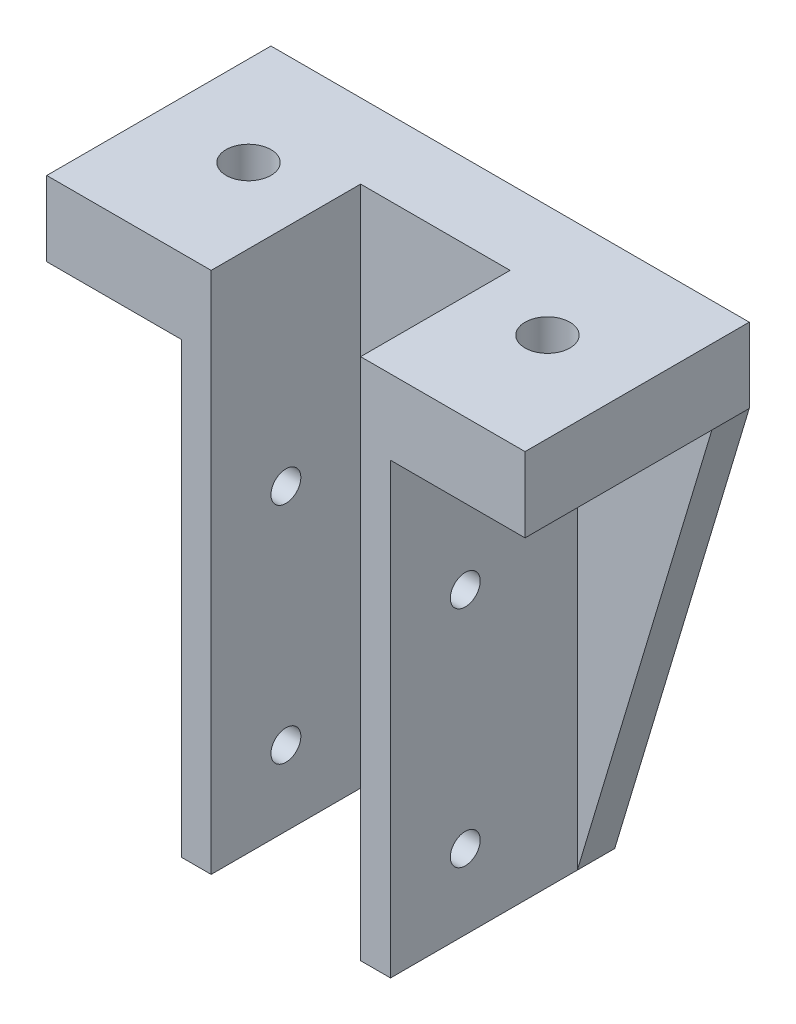
ISO-10303-21;
HEADER;
FILE_DESCRIPTION(('STEP AP214'),'2;1');
FILE_NAME('part.step','',(''),(''),'','','');
FILE_SCHEMA(('AUTOMOTIVE_DESIGN { 1 0 10303 214 1 1 1 1 }'));
ENDSEC;
DATA;
#1=APPLICATION_CONTEXT('core data for automotive mechanical design processes');
#2=APPLICATION_PROTOCOL_DEFINITION('international standard','automotive_design',2000,#1);
#3=PRODUCT_CONTEXT('',#1,'mechanical');
#4=PRODUCT('Part','Part','',(#3));
#5=PRODUCT_RELATED_PRODUCT_CATEGORY('part','',(#4));
#6=PRODUCT_DEFINITION_FORMATION('','',#4);
#7=PRODUCT_DEFINITION_CONTEXT('part definition',#1,'design');
#8=PRODUCT_DEFINITION('design','',#6,#7);
#9=PRODUCT_DEFINITION_SHAPE('','',#8);
#10=(LENGTH_UNIT() NAMED_UNIT(*) SI_UNIT(.MILLI.,.METRE.));
#11=(NAMED_UNIT(*) PLANE_ANGLE_UNIT() SI_UNIT($,.RADIAN.));
#12=(NAMED_UNIT(*) SI_UNIT($,.STERADIAN.) SOLID_ANGLE_UNIT());
#13=UNCERTAINTY_MEASURE_WITH_UNIT(LENGTH_MEASURE(1.E-05),#10,'distance_accuracy_value','');
#14=(GEOMETRIC_REPRESENTATION_CONTEXT(3) GLOBAL_UNCERTAINTY_ASSIGNED_CONTEXT((#13)) GLOBAL_UNIT_ASSIGNED_CONTEXT((#10,
#11,#12)) REPRESENTATION_CONTEXT('',''));
#15=CARTESIAN_POINT('',(0.,0.,0.));
#16=DIRECTION('',(0.,0.,1.));
#17=DIRECTION('',(1.,0.,0.));
#18=AXIS2_PLACEMENT_3D('',#15,#16,#17);
#19=CARTESIAN_POINT('',(-14.,35.,30.));
#20=DIRECTION('',(1.,0.,0.));
#21=DIRECTION('',(0.,1.,0.));
#22=AXIS2_PLACEMENT_3D('',#19,#20,#21);
#23=PLANE('',#22);
#24=CARTESIAN_POINT('',(-14.,-25.,20.));
#25=DIRECTION('',(1.,0.,0.));
#26=DIRECTION('',(0.,1.,0.));
#27=AXIS2_PLACEMENT_3D('',#24,#25,#26);
#28=CIRCLE('',#27,2.);
#29=CARTESIAN_POINT('',(-14.,-23.,20.));
#30=VERTEX_POINT('',#29);
#31=EDGE_CURVE('E298',#30,#30,#28,.T.);
#32=ORIENTED_EDGE('',*,*,#31,.T.);
#33=EDGE_LOOP('',(#32));
#34=FACE_BOUND('',#33,.T.);
#35=CARTESIAN_POINT('',(-14.,4.99999999999999,20.));
#36=DIRECTION('',(1.,0.,0.));
#37=DIRECTION('',(0.,1.,0.));
#38=AXIS2_PLACEMENT_3D('',#35,#36,#37);
#39=CIRCLE('',#38,2.);
#40=CARTESIAN_POINT('',(-14.,7.,20.));
#41=VERTEX_POINT('',#40);
#42=EDGE_CURVE('E280',#41,#41,#39,.T.);
#43=ORIENTED_EDGE('',*,*,#42,.T.);
#44=EDGE_LOOP('',(#43));
#45=FACE_BOUND('',#44,.T.);
#46=DIRECTION('',(0.,0.,1.));
#47=VECTOR('',#46,1.);
#48=CARTESIAN_POINT('',(-14.,25.,0.));
#49=LINE('',#48,#47);
#50=CARTESIAN_POINT('',(-14.,25.,5.));
#51=VERTEX_POINT('',#50);
#52=CARTESIAN_POINT('',(-14.,25.,30.));
#53=VERTEX_POINT('',#52);
#54=EDGE_CURVE('E184',#51,#53,#49,.T.);
#55=ORIENTED_EDGE('',*,*,#54,.F.);
#56=DIRECTION('',(0.,1.,0.));
#57=VECTOR('',#56,1.);
#58=CARTESIAN_POINT('',(-14.,-35.,5.));
#59=LINE('',#58,#57);
#60=CARTESIAN_POINT('',(-14.,-35.,5.));
#61=VERTEX_POINT('',#60);
#62=EDGE_CURVE('E151',#61,#51,#59,.T.);
#63=ORIENTED_EDGE('',*,*,#62,.F.);
#64=DIRECTION('',(0.,0.,-1.));
#65=VECTOR('',#64,1.);
#66=CARTESIAN_POINT('',(-14.,-35.,30.));
#67=LINE('',#66,#65);
#68=CARTESIAN_POINT('',(-14.,-35.,30.));
#69=VERTEX_POINT('',#68);
#70=EDGE_CURVE('E11',#69,#61,#67,.T.);
#71=ORIENTED_EDGE('',*,*,#70,.F.);
#72=DIRECTION('',(0.,-1.,0.));
#73=VECTOR('',#72,1.);
#74=CARTESIAN_POINT('',(-14.,35.,30.));
#75=LINE('',#74,#73);
#76=EDGE_CURVE('E261',#53,#69,#75,.T.);
#77=ORIENTED_EDGE('',*,*,#76,.F.);
#78=EDGE_LOOP('',(#55,#63,#71,#77));
#79=FACE_BOUND('',#78,.T.);
#80=ADVANCED_FACE('F35',(#34,#45,#79),#23,.F.);
#81=CARTESIAN_POINT('',(0.,0.,30.));
#82=DIRECTION('',(0.,0.,1.));
#83=DIRECTION('',(1.,0.,0.));
#84=AXIS2_PLACEMENT_3D('',#81,#82,#83);
#85=PLANE('',#84);
#86=DIRECTION('',(0.,-1.,0.));
#87=VECTOR('',#86,1.);
#88=CARTESIAN_POINT('',(-10.,-35.,30.));
#89=LINE('',#88,#87);
#90=CARTESIAN_POINT('',(-10.,35.,30.));
#91=VERTEX_POINT('',#90);
#92=CARTESIAN_POINT('',(-10.,-35.,30.));
#93=VERTEX_POINT('',#92);
#94=EDGE_CURVE('E226',#91,#93,#89,.T.);
#95=ORIENTED_EDGE('',*,*,#94,.F.);
#96=DIRECTION('',(-1.,0.,0.));
#97=VECTOR('',#96,1.);
#98=CARTESIAN_POINT('',(-14.,35.,30.));
#99=LINE('',#98,#97);
#100=CARTESIAN_POINT('',(-32.,35.,30.));
#101=VERTEX_POINT('',#100);
#102=EDGE_CURVE('E257',#91,#101,#99,.T.);
#103=ORIENTED_EDGE('',*,*,#102,.T.);
#104=DIRECTION('',(0.,1.,0.));
#105=VECTOR('',#104,1.);
#106=CARTESIAN_POINT('',(-32.,25.,30.));
#107=LINE('',#106,#105);
#108=CARTESIAN_POINT('',(-32.,25.,30.));
#109=VERTEX_POINT('',#108);
#110=EDGE_CURVE('E168',#109,#101,#107,.T.);
#111=ORIENTED_EDGE('',*,*,#110,.F.);
#112=DIRECTION('',(-1.,0.,0.));
#113=VECTOR('',#112,1.);
#114=CARTESIAN_POINT('',(-14.,25.,30.));
#115=LINE('',#114,#113);
#116=EDGE_CURVE('E164',#53,#109,#115,.T.);
#117=ORIENTED_EDGE('',*,*,#116,.F.);
#118=ORIENTED_EDGE('',*,*,#76,.T.);
#119=DIRECTION('',(1.,0.,0.));
#120=VECTOR('',#119,1.);
#121=CARTESIAN_POINT('',(-14.,-35.,30.));
#122=LINE('',#121,#120);
#123=EDGE_CURVE('E264',#69,#93,#122,.T.);
#124=ORIENTED_EDGE('',*,*,#123,.T.);
#125=EDGE_LOOP('',(#95,#103,#111,#117,#118,#124));
#126=FACE_BOUND('',#125,.T.);
#127=ADVANCED_FACE('F333',(#126),#85,.T.);
#128=CARTESIAN_POINT('',(14.,35.,30.));
#129=DIRECTION('',(-1.,0.,0.));
#130=DIRECTION('',(0.,-1.,0.));
#131=AXIS2_PLACEMENT_3D('',#128,#129,#130);
#132=PLANE('',#131);
#133=CARTESIAN_POINT('',(14.,-25.,20.));
#134=DIRECTION('',(1.,0.,0.));
#135=DIRECTION('',(0.,1.,0.));
#136=AXIS2_PLACEMENT_3D('',#133,#134,#135);
#137=CIRCLE('',#136,2.);
#138=CARTESIAN_POINT('',(14.,-23.,20.));
#139=VERTEX_POINT('',#138);
#140=EDGE_CURVE('E276',#139,#139,#137,.T.);
#141=ORIENTED_EDGE('',*,*,#140,.F.);
#142=EDGE_LOOP('',(#141));
#143=FACE_BOUND('',#142,.T.);
#144=CARTESIAN_POINT('',(14.,5.,20.));
#145=DIRECTION('',(1.,0.,0.));
#146=DIRECTION('',(0.,1.,0.));
#147=AXIS2_PLACEMENT_3D('',#144,#145,#146);
#148=CIRCLE('',#147,2.);
#149=CARTESIAN_POINT('',(14.,7.,20.));
#150=VERTEX_POINT('',#149);
#151=EDGE_CURVE('E283',#150,#150,#148,.T.);
#152=ORIENTED_EDGE('',*,*,#151,.F.);
#153=EDGE_LOOP('',(#152));
#154=FACE_BOUND('',#153,.T.);
#155=DIRECTION('',(0.,0.,-1.));
#156=VECTOR('',#155,1.);
#157=CARTESIAN_POINT('',(14.,-35.,30.));
#158=LINE('',#157,#156);
#159=CARTESIAN_POINT('',(14.,-35.,30.));
#160=VERTEX_POINT('',#159);
#161=CARTESIAN_POINT('',(14.,-35.,5.));
#162=VERTEX_POINT('',#161);
#163=EDGE_CURVE('E44',#160,#162,#158,.T.);
#164=ORIENTED_EDGE('',*,*,#163,.T.);
#165=DIRECTION('',(0.,1.,0.));
#166=VECTOR('',#165,1.);
#167=CARTESIAN_POINT('',(14.,-35.,5.));
#168=LINE('',#167,#166);
#169=CARTESIAN_POINT('',(14.,25.,5.));
#170=VERTEX_POINT('',#169);
#171=EDGE_CURVE('E199',#162,#170,#168,.T.);
#172=ORIENTED_EDGE('',*,*,#171,.T.);
#173=DIRECTION('',(0.,0.,1.));
#174=VECTOR('',#173,1.);
#175=CARTESIAN_POINT('',(14.,25.,0.));
#176=LINE('',#175,#174);
#177=CARTESIAN_POINT('',(14.,25.,30.));
#178=VERTEX_POINT('',#177);
#179=EDGE_CURVE('E52',#170,#178,#176,.T.);
#180=ORIENTED_EDGE('',*,*,#179,.T.);
#181=DIRECTION('',(0.,1.,0.));
#182=VECTOR('',#181,1.);
#183=CARTESIAN_POINT('',(14.,35.,30.));
#184=LINE('',#183,#182);
#185=EDGE_CURVE('E254',#160,#178,#184,.T.);
#186=ORIENTED_EDGE('',*,*,#185,.F.);
#187=EDGE_LOOP('',(#164,#172,#180,#186));
#188=FACE_BOUND('',#187,.T.);
#189=ADVANCED_FACE('F37',(#143,#154,#188),#132,.F.);
#190=CARTESIAN_POINT('',(-14.,35.,30.));
#191=DIRECTION('',(0.,-1.,0.));
#192=DIRECTION('',(0.,0.,-1.));
#193=AXIS2_PLACEMENT_3D('',#190,#191,#192);
#194=PLANE('',#193);
#195=DIRECTION('',(0.,0.,1.));
#196=VECTOR('',#195,1.);
#197=CARTESIAN_POINT('',(10.,35.,10.));
#198=LINE('',#197,#196);
#199=CARTESIAN_POINT('',(10.,35.,10.));
#200=VERTEX_POINT('',#199);
#201=CARTESIAN_POINT('',(10.,35.,30.));
#202=VERTEX_POINT('',#201);
#203=EDGE_CURVE('E248',#200,#202,#198,.T.);
#204=ORIENTED_EDGE('',*,*,#203,.T.);
#205=CARTESIAN_POINT('',(32.,35.,30.));
#206=VERTEX_POINT('',#205);
#207=EDGE_CURVE('E259',#206,#202,#99,.T.);
#208=ORIENTED_EDGE('',*,*,#207,.F.);
#209=DIRECTION('',(0.,0.,-1.));
#210=VECTOR('',#209,1.);
#211=CARTESIAN_POINT('',(32.,35.,0.));
#212=LINE('',#211,#210);
#213=CARTESIAN_POINT('',(32.,35.,0.));
#214=VERTEX_POINT('',#213);
#215=EDGE_CURVE('E214',#206,#214,#212,.T.);
#216=ORIENTED_EDGE('',*,*,#215,.T.);
#217=DIRECTION('',(-1.,0.,0.));
#218=VECTOR('',#217,1.);
#219=CARTESIAN_POINT('',(-14.,35.,0.));
#220=LINE('',#219,#218);
#221=CARTESIAN_POINT('',(-32.,35.,0.));
#222=VERTEX_POINT('',#221);
#223=EDGE_CURVE('E247',#214,#222,#220,.T.);
#224=ORIENTED_EDGE('',*,*,#223,.T.);
#225=DIRECTION('',(0.,0.,-1.));
#226=VECTOR('',#225,1.);
#227=CARTESIAN_POINT('',(-32.,35.,0.));
#228=LINE('',#227,#226);
#229=EDGE_CURVE('E186',#101,#222,#228,.T.);
#230=ORIENTED_EDGE('',*,*,#229,.F.);
#231=ORIENTED_EDGE('',*,*,#102,.F.);
#232=DIRECTION('',(0.,0.,1.));
#233=VECTOR('',#232,1.);
#234=CARTESIAN_POINT('',(-10.,35.,10.));
#235=LINE('',#234,#233);
#236=CARTESIAN_POINT('',(-10.,35.,10.));
#237=VERTEX_POINT('',#236);
#238=EDGE_CURVE('E245',#237,#91,#235,.T.);
#239=ORIENTED_EDGE('',*,*,#238,.F.);
#240=DIRECTION('',(-1.,0.,0.));
#241=VECTOR('',#240,1.);
#242=CARTESIAN_POINT('',(10.,35.,10.));
#243=LINE('',#242,#241);
#244=EDGE_CURVE('E239',#200,#237,#243,.T.);
#245=ORIENTED_EDGE('',*,*,#244,.F.);
#246=EDGE_LOOP('',(#204,#208,#216,#224,#230,#231,#239,#245));
#247=FACE_BOUND('',#246,.T.);
#248=CARTESIAN_POINT('',(-20.,35.,15.));
#249=DIRECTION('',(0.,-1.,0.));
#250=DIRECTION('',(0.,0.,1.));
#251=AXIS2_PLACEMENT_3D('',#248,#249,#250);
#252=CIRCLE('',#251,3.);
#253=CARTESIAN_POINT('',(-20.,35.,18.));
#254=VERTEX_POINT('',#253);
#255=EDGE_CURVE('E176',#254,#254,#252,.T.);
#256=ORIENTED_EDGE('',*,*,#255,.T.);
#257=EDGE_LOOP('',(#256));
#258=FACE_BOUND('',#257,.T.);
#259=CARTESIAN_POINT('',(20.,35.,15.));
#260=DIRECTION('',(0.,1.,0.));
#261=DIRECTION('',(0.,0.,1.));
#262=AXIS2_PLACEMENT_3D('',#259,#260,#261);
#263=CIRCLE('',#262,3.);
#264=CARTESIAN_POINT('',(20.,35.,18.));
#265=VERTEX_POINT('',#264);
#266=EDGE_CURVE('E206',#265,#265,#263,.T.);
#267=ORIENTED_EDGE('',*,*,#266,.F.);
#268=EDGE_LOOP('',(#267));
#269=FACE_BOUND('',#268,.T.);
#270=ADVANCED_FACE('F336',(#247,#258,#269),#194,.F.);
#271=CARTESIAN_POINT('',(-14.,-35.,30.));
#272=DIRECTION('',(0.,1.,0.));
#273=DIRECTION('',(0.,0.,1.));
#274=AXIS2_PLACEMENT_3D('',#271,#272,#273);
#275=PLANE('',#274);
#276=DIRECTION('',(1.,0.,0.));
#277=VECTOR('',#276,1.);
#278=CARTESIAN_POINT('',(10.,-35.,10.));
#279=LINE('',#278,#277);
#280=CARTESIAN_POINT('',(-10.,-35.,10.));
#281=VERTEX_POINT('',#280);
#282=CARTESIAN_POINT('',(10.,-35.,10.));
#283=VERTEX_POINT('',#282);
#284=EDGE_CURVE('E232',#281,#283,#279,.T.);
#285=ORIENTED_EDGE('',*,*,#284,.F.);
#286=DIRECTION('',(0.,0.,1.));
#287=VECTOR('',#286,1.);
#288=CARTESIAN_POINT('',(-10.,-35.,10.));
#289=LINE('',#288,#287);
#290=EDGE_CURVE('E242',#281,#93,#289,.T.);
#291=ORIENTED_EDGE('',*,*,#290,.T.);
#292=ORIENTED_EDGE('',*,*,#123,.F.);
#293=ORIENTED_EDGE('',*,*,#70,.T.);
#294=DIRECTION('',(0.,0.,-1.));
#295=VECTOR('',#294,1.);
#296=CARTESIAN_POINT('',(-14.,-35.,5.));
#297=LINE('',#296,#295);
#298=CARTESIAN_POINT('',(-14.,-35.,0.));
#299=VERTEX_POINT('',#298);
#300=EDGE_CURVE('E147',#61,#299,#297,.T.);
#301=ORIENTED_EDGE('',*,*,#300,.T.);
#302=DIRECTION('',(1.,0.,0.));
#303=VECTOR('',#302,1.);
#304=CARTESIAN_POINT('',(-14.,-35.,0.));
#305=LINE('',#304,#303);
#306=CARTESIAN_POINT('',(14.,-35.,0.));
#307=VERTEX_POINT('',#306);
#308=EDGE_CURVE('E258',#299,#307,#305,.T.);
#309=ORIENTED_EDGE('',*,*,#308,.T.);
#310=DIRECTION('',(0.,0.,-1.));
#311=VECTOR('',#310,1.);
#312=CARTESIAN_POINT('',(14.,-35.,5.));
#313=LINE('',#312,#311);
#314=EDGE_CURVE('E204',#162,#307,#313,.T.);
#315=ORIENTED_EDGE('',*,*,#314,.F.);
#316=ORIENTED_EDGE('',*,*,#163,.F.);
#317=CARTESIAN_POINT('',(10.,-35.,30.));
#318=VERTEX_POINT('',#317);
#319=EDGE_CURVE('E263',#318,#160,#122,.T.);
#320=ORIENTED_EDGE('',*,*,#319,.F.);
#321=DIRECTION('',(0.,0.,1.));
#322=VECTOR('',#321,1.);
#323=CARTESIAN_POINT('',(10.,-35.,10.));
#324=LINE('',#323,#322);
#325=EDGE_CURVE('E60',#283,#318,#324,.T.);
#326=ORIENTED_EDGE('',*,*,#325,.F.);
#327=EDGE_LOOP('',(#285,#291,#292,#293,#301,#309,#315,#316,#320,#326));
#328=FACE_BOUND('',#327,.T.);
#329=ADVANCED_FACE('F304',(#328),#275,.F.);
#330=ORIENTED_EDGE('',*,*,#185,.T.);
#331=DIRECTION('',(1.,0.,0.));
#332=VECTOR('',#331,1.);
#333=CARTESIAN_POINT('',(14.,25.,30.));
#334=LINE('',#333,#332);
#335=CARTESIAN_POINT('',(32.,25.,30.));
#336=VERTEX_POINT('',#335);
#337=EDGE_CURVE('E213',#178,#336,#334,.T.);
#338=ORIENTED_EDGE('',*,*,#337,.T.);
#339=DIRECTION('',(0.,1.,0.));
#340=VECTOR('',#339,1.);
#341=CARTESIAN_POINT('',(32.,25.,30.));
#342=LINE('',#341,#340);
#343=EDGE_CURVE('E220',#336,#206,#342,.T.);
#344=ORIENTED_EDGE('',*,*,#343,.T.);
#345=ORIENTED_EDGE('',*,*,#207,.T.);
#346=DIRECTION('',(0.,1.,0.));
#347=VECTOR('',#346,1.);
#348=CARTESIAN_POINT('',(10.,-35.,30.));
#349=LINE('',#348,#347);
#350=EDGE_CURVE('E233',#318,#202,#349,.T.);
#351=ORIENTED_EDGE('',*,*,#350,.F.);
#352=ORIENTED_EDGE('',*,*,#319,.T.);
#353=EDGE_LOOP('',(#330,#338,#344,#345,#351,#352));
#354=FACE_BOUND('',#353,.T.);
#355=ADVANCED_FACE('F320',(#354),#85,.T.);
#356=CARTESIAN_POINT('',(0.,0.,0.));
#357=DIRECTION('',(0.,0.,1.));
#358=DIRECTION('',(1.,0.,0.));
#359=AXIS2_PLACEMENT_3D('',#356,#357,#358);
#360=PLANE('',#359);
#361=CARTESIAN_POINT('',(0.,-20.,0.));
#362=DIRECTION('',(0.,0.,1.));
#363=DIRECTION('',(1.,0.,0.));
#364=AXIS2_PLACEMENT_3D('',#361,#362,#363);
#365=CIRCLE('',#364,2.);
#366=CARTESIAN_POINT('',(2.,-20.,0.));
#367=VERTEX_POINT('',#366);
#368=EDGE_CURVE('E288',#367,#367,#365,.T.);
#369=ORIENTED_EDGE('',*,*,#368,.T.);
#370=EDGE_LOOP('',(#369));
#371=FACE_BOUND('',#370,.T.);
#372=CARTESIAN_POINT('',(0.,20.,0.));
#373=DIRECTION('',(0.,0.,1.));
#374=DIRECTION('',(1.,0.,0.));
#375=AXIS2_PLACEMENT_3D('',#372,#373,#374);
#376=CIRCLE('',#375,2.);
#377=CARTESIAN_POINT('',(2.,20.,0.));
#378=VERTEX_POINT('',#377);
#379=EDGE_CURVE('E448',#378,#378,#376,.T.);
#380=ORIENTED_EDGE('',*,*,#379,.T.);
#381=EDGE_LOOP('',(#380));
#382=FACE_BOUND('',#381,.T.);
#383=DIRECTION('',(0.,1.,0.));
#384=VECTOR('',#383,1.);
#385=CARTESIAN_POINT('',(-32.,25.,0.));
#386=LINE('',#385,#384);
#387=CARTESIAN_POINT('',(-32.,25.,0.));
#388=VERTEX_POINT('',#387);
#389=EDGE_CURVE('E173',#388,#222,#386,.T.);
#390=ORIENTED_EDGE('',*,*,#389,.T.);
#391=ORIENTED_EDGE('',*,*,#223,.F.);
#392=DIRECTION('',(0.,1.,0.));
#393=VECTOR('',#392,1.);
#394=CARTESIAN_POINT('',(32.,25.,0.));
#395=LINE('',#394,#393);
#396=CARTESIAN_POINT('',(32.,25.,0.));
#397=VERTEX_POINT('',#396);
#398=EDGE_CURVE('E223',#397,#214,#395,.T.);
#399=ORIENTED_EDGE('',*,*,#398,.F.);
#400=DIRECTION('',(-0.287347885566345,-0.957826285221151,0.));
#401=VECTOR('',#400,1.);
#402=CARTESIAN_POINT('',(32.,25.,0.));
#403=LINE('',#402,#401);
#404=EDGE_CURVE('E190',#397,#307,#403,.T.);
#405=ORIENTED_EDGE('',*,*,#404,.T.);
#406=ORIENTED_EDGE('',*,*,#308,.F.);
#407=DIRECTION('',(0.287347885566345,-0.957826285221151,0.));
#408=VECTOR('',#407,1.);
#409=CARTESIAN_POINT('',(-32.,25.,0.));
#410=LINE('',#409,#408);
#411=EDGE_CURVE('E159',#388,#299,#410,.T.);
#412=ORIENTED_EDGE('',*,*,#411,.F.);
#413=EDGE_LOOP('',(#390,#391,#399,#405,#406,#412));
#414=FACE_BOUND('',#413,.T.);
#415=ADVANCED_FACE('F308',(#371,#382,#414),#360,.F.);
#416=CARTESIAN_POINT('',(-10.,-35.,10.));
#417=DIRECTION('',(-1.,0.,0.));
#418=DIRECTION('',(0.,0.,1.));
#419=AXIS2_PLACEMENT_3D('',#416,#417,#418);
#420=PLANE('',#419);
#421=CARTESIAN_POINT('',(-10.,-25.,20.));
#422=DIRECTION('',(-1.,0.,0.));
#423=DIRECTION('',(0.,0.,1.));
#424=AXIS2_PLACEMENT_3D('',#421,#422,#423);
#425=CIRCLE('',#424,2.);
#426=CARTESIAN_POINT('',(-10.,-25.,22.));
#427=VERTEX_POINT('',#426);
#428=EDGE_CURVE('E295',#427,#427,#425,.T.);
#429=ORIENTED_EDGE('',*,*,#428,.T.);
#430=EDGE_LOOP('',(#429));
#431=FACE_BOUND('',#430,.T.);
#432=CARTESIAN_POINT('',(-9.99999999999999,4.99999999999999,20.));
#433=DIRECTION('',(-1.,0.,0.));
#434=DIRECTION('',(0.,0.,1.));
#435=AXIS2_PLACEMENT_3D('',#432,#433,#434);
#436=CIRCLE('',#435,2.);
#437=CARTESIAN_POINT('',(-9.99999999999999,4.99999999999999,22.));
#438=VERTEX_POINT('',#437);
#439=EDGE_CURVE('E275',#438,#438,#436,.T.);
#440=ORIENTED_EDGE('',*,*,#439,.T.);
#441=EDGE_LOOP('',(#440));
#442=FACE_BOUND('',#441,.T.);
#443=ORIENTED_EDGE('',*,*,#94,.T.);
#444=ORIENTED_EDGE('',*,*,#290,.F.);
#445=DIRECTION('',(0.,-1.,0.));
#446=VECTOR('',#445,1.);
#447=CARTESIAN_POINT('',(-10.,-35.,10.));
#448=LINE('',#447,#446);
#449=EDGE_CURVE('E229',#237,#281,#448,.T.);
#450=ORIENTED_EDGE('',*,*,#449,.F.);
#451=ORIENTED_EDGE('',*,*,#238,.T.);
#452=EDGE_LOOP('',(#443,#444,#450,#451));
#453=FACE_BOUND('',#452,.T.);
#454=ADVANCED_FACE('F329',(#431,#442,#453),#420,.F.);
#455=CARTESIAN_POINT('',(10.,-35.,10.));
#456=DIRECTION('',(1.,0.,0.));
#457=DIRECTION('',(0.,0.,-1.));
#458=AXIS2_PLACEMENT_3D('',#455,#456,#457);
#459=PLANE('',#458);
#460=CARTESIAN_POINT('',(9.99999999999999,-25.,20.));
#461=DIRECTION('',(1.,0.,0.));
#462=DIRECTION('',(0.,0.,-1.));
#463=AXIS2_PLACEMENT_3D('',#460,#461,#462);
#464=CIRCLE('',#463,2.);
#465=CARTESIAN_POINT('',(9.99999999999999,-25.,18.));
#466=VERTEX_POINT('',#465);
#467=EDGE_CURVE('E39',#466,#466,#464,.T.);
#468=ORIENTED_EDGE('',*,*,#467,.T.);
#469=EDGE_LOOP('',(#468));
#470=FACE_BOUND('',#469,.T.);
#471=CARTESIAN_POINT('',(9.99999999999999,4.99999999999999,20.));
#472=DIRECTION('',(1.,0.,0.));
#473=DIRECTION('',(0.,0.,-1.));
#474=AXIS2_PLACEMENT_3D('',#471,#472,#473);
#475=CIRCLE('',#474,2.);
#476=CARTESIAN_POINT('',(9.99999999999999,4.99999999999999,18.));
#477=VERTEX_POINT('',#476);
#478=EDGE_CURVE('E273',#477,#477,#475,.T.);
#479=ORIENTED_EDGE('',*,*,#478,.T.);
#480=EDGE_LOOP('',(#479));
#481=FACE_BOUND('',#480,.T.);
#482=ORIENTED_EDGE('',*,*,#350,.T.);
#483=ORIENTED_EDGE('',*,*,#203,.F.);
#484=DIRECTION('',(0.,1.,0.));
#485=VECTOR('',#484,1.);
#486=CARTESIAN_POINT('',(10.,-35.,10.));
#487=LINE('',#486,#485);
#488=EDGE_CURVE('E236',#283,#200,#487,.T.);
#489=ORIENTED_EDGE('',*,*,#488,.F.);
#490=ORIENTED_EDGE('',*,*,#325,.T.);
#491=EDGE_LOOP('',(#482,#483,#489,#490));
#492=FACE_BOUND('',#491,.T.);
#493=ADVANCED_FACE('F386',(#470,#481,#492),#459,.F.);
#494=CARTESIAN_POINT('',(0.,0.,10.));
#495=DIRECTION('',(0.,0.,1.));
#496=DIRECTION('',(1.,0.,0.));
#497=AXIS2_PLACEMENT_3D('',#494,#495,#496);
#498=PLANE('',#497);
#499=CARTESIAN_POINT('',(0.,-20.,10.));
#500=DIRECTION('',(0.,0.,1.));
#501=DIRECTION('',(1.,0.,0.));
#502=AXIS2_PLACEMENT_3D('',#499,#500,#501);
#503=CIRCLE('',#502,2.);
#504=CARTESIAN_POINT('',(2.,-20.,10.));
#505=VERTEX_POINT('',#504);
#506=EDGE_CURVE('E445',#505,#505,#503,.T.);
#507=ORIENTED_EDGE('',*,*,#506,.F.);
#508=EDGE_LOOP('',(#507));
#509=FACE_BOUND('',#508,.T.);
#510=CARTESIAN_POINT('',(0.,20.,10.));
#511=DIRECTION('',(0.,0.,1.));
#512=DIRECTION('',(1.,0.,0.));
#513=AXIS2_PLACEMENT_3D('',#510,#511,#512);
#514=CIRCLE('',#513,2.);
#515=CARTESIAN_POINT('',(2.,20.,10.));
#516=VERTEX_POINT('',#515);
#517=EDGE_CURVE('E452',#516,#516,#514,.T.);
#518=ORIENTED_EDGE('',*,*,#517,.F.);
#519=EDGE_LOOP('',(#518));
#520=FACE_BOUND('',#519,.T.);
#521=ORIENTED_EDGE('',*,*,#449,.T.);
#522=ORIENTED_EDGE('',*,*,#284,.T.);
#523=ORIENTED_EDGE('',*,*,#488,.T.);
#524=ORIENTED_EDGE('',*,*,#244,.T.);
#525=EDGE_LOOP('',(#521,#522,#523,#524));
#526=FACE_BOUND('',#525,.T.);
#527=ADVANCED_FACE('F325',(#509,#520,#526),#498,.T.);
#528=CARTESIAN_POINT('',(32.,25.,0.));
#529=DIRECTION('',(1.,0.,0.));
#530=DIRECTION('',(0.,0.,-1.));
#531=AXIS2_PLACEMENT_3D('',#528,#529,#530);
#532=PLANE('',#531);
#533=ORIENTED_EDGE('',*,*,#215,.F.);
#534=ORIENTED_EDGE('',*,*,#343,.F.);
#535=DIRECTION('',(0.,0.,-1.));
#536=VECTOR('',#535,1.);
#537=CARTESIAN_POINT('',(32.,25.,0.));
#538=LINE('',#537,#536);
#539=CARTESIAN_POINT('',(32.,25.,5.));
#540=VERTEX_POINT('',#539);
#541=EDGE_CURVE('E217',#336,#540,#538,.T.);
#542=ORIENTED_EDGE('',*,*,#541,.T.);
#543=DIRECTION('',(0.,0.,-1.));
#544=VECTOR('',#543,1.);
#545=CARTESIAN_POINT('',(32.,25.,5.));
#546=LINE('',#545,#544);
#547=EDGE_CURVE('E201',#540,#397,#546,.T.);
#548=ORIENTED_EDGE('',*,*,#547,.T.);
#549=ORIENTED_EDGE('',*,*,#398,.T.);
#550=EDGE_LOOP('',(#533,#534,#542,#548,#549));
#551=FACE_BOUND('',#550,.T.);
#552=ADVANCED_FACE('F315',(#551),#532,.T.);
#553=CARTESIAN_POINT('',(0.,25.,0.));
#554=DIRECTION('',(0.,1.,0.));
#555=DIRECTION('',(0.,0.,1.));
#556=AXIS2_PLACEMENT_3D('',#553,#554,#555);
#557=PLANE('',#556);
#558=CARTESIAN_POINT('',(20.,25.,15.));
#559=DIRECTION('',(0.,1.,0.));
#560=DIRECTION('',(0.,0.,1.));
#561=AXIS2_PLACEMENT_3D('',#558,#559,#560);
#562=CIRCLE('',#561,3.);
#563=CARTESIAN_POINT('',(20.,25.,18.));
#564=VERTEX_POINT('',#563);
#565=EDGE_CURVE('E211',#564,#564,#562,.T.);
#566=ORIENTED_EDGE('',*,*,#565,.T.);
#567=EDGE_LOOP('',(#566));
#568=FACE_BOUND('',#567,.T.);
#569=ORIENTED_EDGE('',*,*,#179,.F.);
#570=DIRECTION('',(1.,0.,0.));
#571=VECTOR('',#570,1.);
#572=CARTESIAN_POINT('',(14.,25.,5.));
#573=LINE('',#572,#571);
#574=EDGE_CURVE('E194',#170,#540,#573,.T.);
#575=ORIENTED_EDGE('',*,*,#574,.T.);
#576=ORIENTED_EDGE('',*,*,#541,.F.);
#577=ORIENTED_EDGE('',*,*,#337,.F.);
#578=EDGE_LOOP('',(#569,#575,#576,#577));
#579=FACE_BOUND('',#578,.T.);
#580=ADVANCED_FACE('F318',(#568,#579),#557,.F.);
#581=CARTESIAN_POINT('',(20.,16.,15.));
#582=DIRECTION('',(0.,1.,0.));
#583=DIRECTION('',(0.,0.,1.));
#584=AXIS2_PLACEMENT_3D('',#581,#582,#583);
#585=CYLINDRICAL_SURFACE('',#584,3.);
#586=ORIENTED_EDGE('',*,*,#266,.T.);
#587=EDGE_LOOP('',(#586));
#588=FACE_BOUND('',#587,.T.);
#589=ORIENTED_EDGE('',*,*,#565,.F.);
#590=EDGE_LOOP('',(#589));
#591=FACE_BOUND('',#590,.T.);
#592=ADVANCED_FACE('F530',(#588,#591),#585,.F.);
#593=CARTESIAN_POINT('',(32.,25.,5.));
#594=DIRECTION('',(0.957826285221152,-0.287347885566345,0.));
#595=DIRECTION('',(0.287347885566345,0.957826285221152,0.));
#596=AXIS2_PLACEMENT_3D('',#593,#594,#595);
#597=PLANE('',#596);
#598=ORIENTED_EDGE('',*,*,#404,.F.);
#599=ORIENTED_EDGE('',*,*,#547,.F.);
#600=DIRECTION('',(-0.287347885566345,-0.957826285221151,0.));
#601=VECTOR('',#600,1.);
#602=CARTESIAN_POINT('',(32.,25.,5.));
#603=LINE('',#602,#601);
#604=EDGE_CURVE('E197',#540,#162,#603,.T.);
#605=ORIENTED_EDGE('',*,*,#604,.T.);
#606=ORIENTED_EDGE('',*,*,#314,.T.);
#607=EDGE_LOOP('',(#598,#599,#605,#606));
#608=FACE_BOUND('',#607,.T.);
#609=ADVANCED_FACE('F311',(#608),#597,.T.);
#610=CARTESIAN_POINT('',(0.,0.,5.));
#611=DIRECTION('',(0.,0.,1.));
#612=DIRECTION('',(1.,0.,0.));
#613=AXIS2_PLACEMENT_3D('',#610,#611,#612);
#614=PLANE('',#613);
#615=ORIENTED_EDGE('',*,*,#574,.F.);
#616=ORIENTED_EDGE('',*,*,#171,.F.);
#617=ORIENTED_EDGE('',*,*,#604,.F.);
#618=EDGE_LOOP('',(#615,#616,#617));
#619=FACE_BOUND('',#618,.T.);
#620=ADVANCED_FACE('F508',(#619),#614,.T.);
#621=CARTESIAN_POINT('',(-32.,25.,0.));
#622=DIRECTION('',(-1.,0.,0.));
#623=DIRECTION('',(0.,0.,-1.));
#624=AXIS2_PLACEMENT_3D('',#621,#622,#623);
#625=PLANE('',#624);
#626=ORIENTED_EDGE('',*,*,#229,.T.);
#627=ORIENTED_EDGE('',*,*,#389,.F.);
#628=DIRECTION('',(0.,0.,-1.));
#629=VECTOR('',#628,1.);
#630=CARTESIAN_POINT('',(-32.,25.,5.));
#631=LINE('',#630,#629);
#632=CARTESIAN_POINT('',(-32.,25.,5.));
#633=VERTEX_POINT('',#632);
#634=EDGE_CURVE('E144',#633,#388,#631,.T.);
#635=ORIENTED_EDGE('',*,*,#634,.F.);
#636=DIRECTION('',(0.,0.,-1.));
#637=VECTOR('',#636,1.);
#638=CARTESIAN_POINT('',(-32.,25.,0.));
#639=LINE('',#638,#637);
#640=EDGE_CURVE('E162',#109,#633,#639,.T.);
#641=ORIENTED_EDGE('',*,*,#640,.F.);
#642=ORIENTED_EDGE('',*,*,#110,.T.);
#643=EDGE_LOOP('',(#626,#627,#635,#641,#642));
#644=FACE_BOUND('',#643,.T.);
#645=ADVANCED_FACE('F171',(#644),#625,.T.);
#646=CARTESIAN_POINT('',(0.,25.,0.));
#647=DIRECTION('',(0.,1.,0.));
#648=DIRECTION('',(0.,0.,1.));
#649=AXIS2_PLACEMENT_3D('',#646,#647,#648);
#650=PLANE('',#649);
#651=CARTESIAN_POINT('',(-20.,25.,15.));
#652=DIRECTION('',(0.,-1.,0.));
#653=DIRECTION('',(0.,0.,1.));
#654=AXIS2_PLACEMENT_3D('',#651,#652,#653);
#655=CIRCLE('',#654,3.);
#656=CARTESIAN_POINT('',(-20.,25.,18.));
#657=VERTEX_POINT('',#656);
#658=EDGE_CURVE('E183',#657,#657,#655,.T.);
#659=ORIENTED_EDGE('',*,*,#658,.F.);
#660=EDGE_LOOP('',(#659));
#661=FACE_BOUND('',#660,.T.);
#662=ORIENTED_EDGE('',*,*,#54,.T.);
#663=ORIENTED_EDGE('',*,*,#116,.T.);
#664=ORIENTED_EDGE('',*,*,#640,.T.);
#665=DIRECTION('',(-1.,0.,0.));
#666=VECTOR('',#665,1.);
#667=CARTESIAN_POINT('',(-14.,25.,5.));
#668=LINE('',#667,#666);
#669=EDGE_CURVE('E152',#51,#633,#668,.T.);
#670=ORIENTED_EDGE('',*,*,#669,.F.);
#671=EDGE_LOOP('',(#662,#663,#664,#670));
#672=FACE_BOUND('',#671,.T.);
#673=ADVANCED_FACE('F163',(#661,#672),#650,.F.);
#674=CARTESIAN_POINT('',(-20.,16.,15.));
#675=DIRECTION('',(0.,1.,0.));
#676=DIRECTION('',(0.,0.,1.));
#677=AXIS2_PLACEMENT_3D('',#674,#675,#676);
#678=CYLINDRICAL_SURFACE('',#677,3.);
#679=ORIENTED_EDGE('',*,*,#255,.F.);
#680=EDGE_LOOP('',(#679));
#681=FACE_BOUND('',#680,.T.);
#682=ORIENTED_EDGE('',*,*,#658,.T.);
#683=EDGE_LOOP('',(#682));
#684=FACE_BOUND('',#683,.T.);
#685=ADVANCED_FACE('F487',(#681,#684),#678,.F.);
#686=CARTESIAN_POINT('',(-32.,25.,5.));
#687=DIRECTION('',(-0.957826285221152,-0.287347885566345,0.));
#688=DIRECTION('',(-0.287347885566345,0.957826285221152,0.));
#689=AXIS2_PLACEMENT_3D('',#686,#687,#688);
#690=PLANE('',#689);
#691=ORIENTED_EDGE('',*,*,#411,.T.);
#692=ORIENTED_EDGE('',*,*,#300,.F.);
#693=DIRECTION('',(0.287347885566345,-0.957826285221151,0.));
#694=VECTOR('',#693,1.);
#695=CARTESIAN_POINT('',(-32.,25.,5.));
#696=LINE('',#695,#694);
#697=EDGE_CURVE('E140',#633,#61,#696,.T.);
#698=ORIENTED_EDGE('',*,*,#697,.F.);
#699=ORIENTED_EDGE('',*,*,#634,.T.);
#700=EDGE_LOOP('',(#691,#692,#698,#699));
#701=FACE_BOUND('',#700,.T.);
#702=ADVANCED_FACE('F142',(#701),#690,.T.);
#703=CARTESIAN_POINT('',(0.,0.,5.));
#704=DIRECTION('',(0.,0.,1.));
#705=DIRECTION('',(-1.,0.,0.));
#706=AXIS2_PLACEMENT_3D('',#703,#704,#705);
#707=PLANE('',#706);
#708=ORIENTED_EDGE('',*,*,#669,.T.);
#709=ORIENTED_EDGE('',*,*,#697,.T.);
#710=ORIENTED_EDGE('',*,*,#62,.T.);
#711=EDGE_LOOP('',(#708,#709,#710));
#712=FACE_BOUND('',#711,.T.);
#713=ADVANCED_FACE('F155',(#712),#707,.T.);
#714=CARTESIAN_POINT('',(-84.,4.99999999999998,20.));
#715=DIRECTION('',(1.,0.,0.));
#716=DIRECTION('',(0.,1.,0.));
#717=AXIS2_PLACEMENT_3D('',#714,#715,#716);
#718=CYLINDRICAL_SURFACE('',#717,2.);
#719=ORIENTED_EDGE('',*,*,#151,.T.);
#720=EDGE_LOOP('',(#719));
#721=FACE_BOUND('',#720,.T.);
#722=ORIENTED_EDGE('',*,*,#478,.F.);
#723=EDGE_LOOP('',(#722));
#724=FACE_BOUND('',#723,.T.);
#725=ADVANCED_FACE('F361',(#721,#724),#718,.F.);
#726=CARTESIAN_POINT('',(-84.,-25.,20.));
#727=DIRECTION('',(1.,0.,0.));
#728=DIRECTION('',(0.,1.,0.));
#729=AXIS2_PLACEMENT_3D('',#726,#727,#728);
#730=CYLINDRICAL_SURFACE('',#729,2.);
#731=ORIENTED_EDGE('',*,*,#140,.T.);
#732=EDGE_LOOP('',(#731));
#733=FACE_BOUND('',#732,.T.);
#734=ORIENTED_EDGE('',*,*,#467,.F.);
#735=EDGE_LOOP('',(#734));
#736=FACE_BOUND('',#735,.T.);
#737=ADVANCED_FACE('F364',(#733,#736),#730,.F.);
#738=ORIENTED_EDGE('',*,*,#439,.F.);
#739=EDGE_LOOP('',(#738));
#740=FACE_BOUND('',#739,.T.);
#741=ORIENTED_EDGE('',*,*,#42,.F.);
#742=EDGE_LOOP('',(#741));
#743=FACE_BOUND('',#742,.T.);
#744=ADVANCED_FACE('F366',(#740,#743),#718,.F.);
#745=ORIENTED_EDGE('',*,*,#428,.F.);
#746=EDGE_LOOP('',(#745));
#747=FACE_BOUND('',#746,.T.);
#748=ORIENTED_EDGE('',*,*,#31,.F.);
#749=EDGE_LOOP('',(#748));
#750=FACE_BOUND('',#749,.T.);
#751=ADVANCED_FACE('F372',(#747,#750),#730,.F.);
#752=CARTESIAN_POINT('',(0.,20.,-88.));
#753=DIRECTION('',(0.,0.,1.));
#754=DIRECTION('',(1.,0.,0.));
#755=AXIS2_PLACEMENT_3D('',#752,#753,#754);
#756=CYLINDRICAL_SURFACE('',#755,2.);
#757=ORIENTED_EDGE('',*,*,#517,.T.);
#758=EDGE_LOOP('',(#757));
#759=FACE_BOUND('',#758,.T.);
#760=ORIENTED_EDGE('',*,*,#379,.F.);
#761=EDGE_LOOP('',(#760));
#762=FACE_BOUND('',#761,.T.);
#763=ADVANCED_FACE('F379',(#759,#762),#756,.F.);
#764=CARTESIAN_POINT('',(0.,-20.,-88.));
#765=DIRECTION('',(0.,0.,1.));
#766=DIRECTION('',(1.,0.,0.));
#767=AXIS2_PLACEMENT_3D('',#764,#765,#766);
#768=CYLINDRICAL_SURFACE('',#767,2.);
#769=ORIENTED_EDGE('',*,*,#506,.T.);
#770=EDGE_LOOP('',(#769));
#771=FACE_BOUND('',#770,.T.);
#772=ORIENTED_EDGE('',*,*,#368,.F.);
#773=EDGE_LOOP('',(#772));
#774=FACE_BOUND('',#773,.T.);
#775=ADVANCED_FACE('F428',(#771,#774),#768,.F.);
#776=CLOSED_SHELL('',(#80,#127,#189,#270,#329,#355,#415,#454,#493,#527,#552,#580,#592,#609,#620,
#645,#673,#685,#702,#713,#725,#737,#744,#751,#763,#775));
#777=MANIFOLD_SOLID_BREP('B2',#776);
#778=ADVANCED_BREP_SHAPE_REPRESENTATION('',(#18,#777),#14);
#779=SHAPE_DEFINITION_REPRESENTATION(#9,#778);
ENDSEC;
END-ISO-10303-21;
